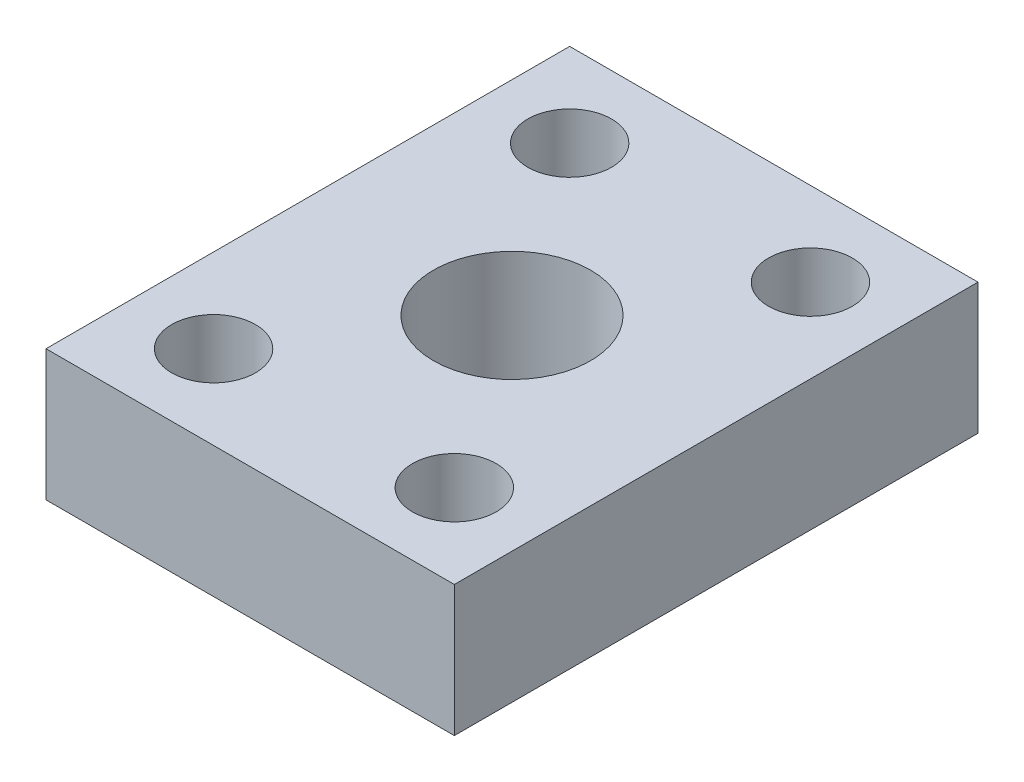
ISO-10303-21;
HEADER;
FILE_DESCRIPTION(('STEP AP214'),'2;1');
FILE_NAME('part.step','',(''),(''),'','','');
FILE_SCHEMA(('AUTOMOTIVE_DESIGN { 1 0 10303 214 1 1 1 1 }'));
ENDSEC;
DATA;
#1=APPLICATION_CONTEXT('core data for automotive mechanical design processes');
#2=APPLICATION_PROTOCOL_DEFINITION('international standard','automotive_design',2000,#1);
#3=PRODUCT_CONTEXT('',#1,'mechanical');
#4=PRODUCT('Part','Part','',(#3));
#5=PRODUCT_RELATED_PRODUCT_CATEGORY('part','',(#4));
#6=PRODUCT_DEFINITION_FORMATION('','',#4);
#7=PRODUCT_DEFINITION_CONTEXT('part definition',#1,'design');
#8=PRODUCT_DEFINITION('design','',#6,#7);
#9=PRODUCT_DEFINITION_SHAPE('','',#8);
#10=(LENGTH_UNIT() NAMED_UNIT(*) SI_UNIT(.MILLI.,.METRE.));
#11=(NAMED_UNIT(*) PLANE_ANGLE_UNIT() SI_UNIT($,.RADIAN.));
#12=(NAMED_UNIT(*) SI_UNIT($,.STERADIAN.) SOLID_ANGLE_UNIT());
#13=UNCERTAINTY_MEASURE_WITH_UNIT(LENGTH_MEASURE(1.E-05),#10,'distance_accuracy_value','');
#14=(GEOMETRIC_REPRESENTATION_CONTEXT(3) GLOBAL_UNCERTAINTY_ASSIGNED_CONTEXT((#13)) GLOBAL_UNIT_ASSIGNED_CONTEXT((#10,
#11,#12)) REPRESENTATION_CONTEXT('',''));
#15=CARTESIAN_POINT('',(0.,0.,0.));
#16=DIRECTION('',(0.,0.,1.));
#17=DIRECTION('',(1.,0.,0.));
#18=AXIS2_PLACEMENT_3D('',#15,#16,#17);
#19=CARTESIAN_POINT('',(0.,3.175,0.));
#20=DIRECTION('',(0.,1.,0.));
#21=DIRECTION('',(0.,0.,1.));
#22=AXIS2_PLACEMENT_3D('',#19,#20,#21);
#23=PLANE('',#22);
#24=CARTESIAN_POINT('',(9.65200000000006,3.175,4.31799999999987));
#25=DIRECTION('',(0.,1.,0.));
#26=DIRECTION('',(0.,0.,1.));
#27=AXIS2_PLACEMENT_3D('',#24,#25,#26);
#28=CIRCLE('',#27,1.016);
#29=CARTESIAN_POINT('',(9.65200000000006,3.175,5.33399999999988));
#30=VERTEX_POINT('',#29);
#31=EDGE_CURVE('E129',#30,#30,#28,.T.);
#32=ORIENTED_EDGE('',*,*,#31,.F.);
#33=EDGE_LOOP('',(#32));
#34=FACE_BOUND('',#33,.T.);
#35=CARTESIAN_POINT('',(15.4910871856785,3.175,-4.31800000000013));
#36=DIRECTION('',(0.,1.,0.));
#37=DIRECTION('',(0.,0.,1.));
#38=AXIS2_PLACEMENT_3D('',#35,#36,#37);
#39=CIRCLE('',#38,1.016);
#40=CARTESIAN_POINT('',(15.4910871856785,3.175,-3.30200000000013));
#41=VERTEX_POINT('',#40);
#42=EDGE_CURVE('E117',#41,#41,#39,.T.);
#43=ORIENTED_EDGE('',*,*,#42,.F.);
#44=EDGE_LOOP('',(#43));
#45=FACE_BOUND('',#44,.T.);
#46=DIRECTION('',(0.,0.,1.));
#47=VECTOR('',#46,1.);
#48=CARTESIAN_POINT('',(7.62,3.175,-6.35));
#49=LINE('',#48,#47);
#50=CARTESIAN_POINT('',(7.62,3.175,-6.35));
#51=VERTEX_POINT('',#50);
#52=CARTESIAN_POINT('',(7.62,3.175,6.35));
#53=VERTEX_POINT('',#52);
#54=EDGE_CURVE('E87',#51,#53,#49,.T.);
#55=ORIENTED_EDGE('',*,*,#54,.T.);
#56=DIRECTION('',(1.,0.,0.));
#57=VECTOR('',#56,1.);
#58=CARTESIAN_POINT('',(7.62,3.175,6.35));
#59=LINE('',#58,#57);
#60=CARTESIAN_POINT('',(17.5230871856784,3.175,6.35));
#61=VERTEX_POINT('',#60);
#62=EDGE_CURVE('E82',#53,#61,#59,.T.);
#63=ORIENTED_EDGE('',*,*,#62,.T.);
#64=DIRECTION('',(0.,0.,-1.));
#65=VECTOR('',#64,1.);
#66=CARTESIAN_POINT('',(17.5230871856784,3.175,-6.35));
#67=LINE('',#66,#65);
#68=CARTESIAN_POINT('',(17.5230871856784,3.175,-6.35));
#69=VERTEX_POINT('',#68);
#70=EDGE_CURVE('E85',#61,#69,#67,.T.);
#71=ORIENTED_EDGE('',*,*,#70,.T.);
#72=DIRECTION('',(-1.,0.,0.));
#73=VECTOR('',#72,1.);
#74=CARTESIAN_POINT('',(7.62,3.175,-6.35));
#75=LINE('',#74,#73);
#76=EDGE_CURVE('E52',#69,#51,#75,.T.);
#77=ORIENTED_EDGE('',*,*,#76,.T.);
#78=EDGE_LOOP('',(#55,#63,#71,#77));
#79=FACE_BOUND('',#78,.T.);
#80=CARTESIAN_POINT('',(12.5715435928393,3.175,-1.21430643318376E-13));
#81=DIRECTION('',(0.,1.,0.));
#82=DIRECTION('',(0.,0.,1.));
#83=AXIS2_PLACEMENT_3D('',#80,#81,#82);
#84=CIRCLE('',#83,1.905);
#85=CARTESIAN_POINT('',(12.5715435928393,3.175,1.90499999999988));
#86=VERTEX_POINT('',#85);
#87=EDGE_CURVE('E102',#86,#86,#84,.T.);
#88=ORIENTED_EDGE('',*,*,#87,.F.);
#89=EDGE_LOOP('',(#88));
#90=FACE_BOUND('',#89,.T.);
#91=CARTESIAN_POINT('',(9.65200000000006,3.175,-4.31800000000013));
#92=DIRECTION('',(0.,1.,0.));
#93=DIRECTION('',(0.,0.,1.));
#94=AXIS2_PLACEMENT_3D('',#91,#92,#93);
#95=CIRCLE('',#94,1.016);
#96=CARTESIAN_POINT('',(9.65200000000006,3.175,-3.30200000000013));
#97=VERTEX_POINT('',#96);
#98=EDGE_CURVE('E123',#97,#97,#95,.T.);
#99=ORIENTED_EDGE('',*,*,#98,.F.);
#100=EDGE_LOOP('',(#99));
#101=FACE_BOUND('',#100,.T.);
#102=CARTESIAN_POINT('',(15.4910871856785,3.175,4.31799999999987));
#103=DIRECTION('',(0.,1.,0.));
#104=DIRECTION('',(0.,0.,1.));
#105=AXIS2_PLACEMENT_3D('',#102,#103,#104);
#106=CIRCLE('',#105,1.016);
#107=CARTESIAN_POINT('',(15.4910871856785,3.175,5.33399999999988));
#108=VERTEX_POINT('',#107);
#109=EDGE_CURVE('E135',#108,#108,#106,.T.);
#110=ORIENTED_EDGE('',*,*,#109,.F.);
#111=EDGE_LOOP('',(#110));
#112=FACE_BOUND('',#111,.T.);
#113=ADVANCED_FACE('F35',(#34,#45,#79,#90,#101,#112),#23,.T.);
#114=CARTESIAN_POINT('',(0.,0.,0.));
#115=DIRECTION('',(0.,1.,0.));
#116=DIRECTION('',(0.,0.,1.));
#117=AXIS2_PLACEMENT_3D('',#114,#115,#116);
#118=PLANE('',#117);
#119=CARTESIAN_POINT('',(9.65200000000006,0.,4.31799999999987));
#120=DIRECTION('',(0.,1.,0.));
#121=DIRECTION('',(0.,0.,1.));
#122=AXIS2_PLACEMENT_3D('',#119,#120,#121);
#123=CIRCLE('',#122,1.016);
#124=CARTESIAN_POINT('',(9.65200000000006,0.,5.33399999999988));
#125=VERTEX_POINT('',#124);
#126=EDGE_CURVE('E132',#125,#125,#123,.T.);
#127=ORIENTED_EDGE('',*,*,#126,.T.);
#128=EDGE_LOOP('',(#127));
#129=FACE_BOUND('',#128,.T.);
#130=CARTESIAN_POINT('',(15.4910871856785,0.,-4.31800000000013));
#131=DIRECTION('',(0.,1.,0.));
#132=DIRECTION('',(0.,0.,1.));
#133=AXIS2_PLACEMENT_3D('',#130,#131,#132);
#134=CIRCLE('',#133,1.016);
#135=CARTESIAN_POINT('',(15.4910871856785,0.,-3.30200000000013));
#136=VERTEX_POINT('',#135);
#137=EDGE_CURVE('E120',#136,#136,#134,.T.);
#138=ORIENTED_EDGE('',*,*,#137,.T.);
#139=EDGE_LOOP('',(#138));
#140=FACE_BOUND('',#139,.T.);
#141=DIRECTION('',(0.,0.,1.));
#142=VECTOR('',#141,1.);
#143=CARTESIAN_POINT('',(7.62,0.,-6.35));
#144=LINE('',#143,#142);
#145=CARTESIAN_POINT('',(7.62,0.,-6.35));
#146=VERTEX_POINT('',#145);
#147=CARTESIAN_POINT('',(7.62,0.,6.35));
#148=VERTEX_POINT('',#147);
#149=EDGE_CURVE('E99',#146,#148,#144,.T.);
#150=ORIENTED_EDGE('',*,*,#149,.F.);
#151=DIRECTION('',(-1.,0.,0.));
#152=VECTOR('',#151,1.);
#153=CARTESIAN_POINT('',(7.62,0.,-6.35));
#154=LINE('',#153,#152);
#155=CARTESIAN_POINT('',(17.5230871856784,0.,-6.35));
#156=VERTEX_POINT('',#155);
#157=EDGE_CURVE('E75',#156,#146,#154,.T.);
#158=ORIENTED_EDGE('',*,*,#157,.F.);
#159=DIRECTION('',(0.,0.,-1.));
#160=VECTOR('',#159,1.);
#161=CARTESIAN_POINT('',(17.5230871856784,0.,-6.35));
#162=LINE('',#161,#160);
#163=CARTESIAN_POINT('',(17.5230871856784,0.,6.35));
#164=VERTEX_POINT('',#163);
#165=EDGE_CURVE('E69',#164,#156,#162,.T.);
#166=ORIENTED_EDGE('',*,*,#165,.F.);
#167=DIRECTION('',(1.,0.,0.));
#168=VECTOR('',#167,1.);
#169=CARTESIAN_POINT('',(7.62,0.,6.35));
#170=LINE('',#169,#168);
#171=EDGE_CURVE('E91',#148,#164,#170,.T.);
#172=ORIENTED_EDGE('',*,*,#171,.F.);
#173=EDGE_LOOP('',(#150,#158,#166,#172));
#174=FACE_BOUND('',#173,.T.);
#175=CARTESIAN_POINT('',(12.5715435928393,0.,-1.21430643318376E-13));
#176=DIRECTION('',(0.,1.,0.));
#177=DIRECTION('',(0.,0.,1.));
#178=AXIS2_PLACEMENT_3D('',#175,#176,#177);
#179=CIRCLE('',#178,1.905);
#180=CARTESIAN_POINT('',(12.5715435928393,0.,1.90499999999988));
#181=VERTEX_POINT('',#180);
#182=EDGE_CURVE('E114',#181,#181,#179,.T.);
#183=ORIENTED_EDGE('',*,*,#182,.T.);
#184=EDGE_LOOP('',(#183));
#185=FACE_BOUND('',#184,.T.);
#186=CARTESIAN_POINT('',(9.65200000000006,0.,-4.31800000000013));
#187=DIRECTION('',(0.,1.,0.));
#188=DIRECTION('',(0.,0.,1.));
#189=AXIS2_PLACEMENT_3D('',#186,#187,#188);
#190=CIRCLE('',#189,1.016);
#191=CARTESIAN_POINT('',(9.65200000000006,0.,-3.30200000000013));
#192=VERTEX_POINT('',#191);
#193=EDGE_CURVE('E126',#192,#192,#190,.T.);
#194=ORIENTED_EDGE('',*,*,#193,.T.);
#195=EDGE_LOOP('',(#194));
#196=FACE_BOUND('',#195,.T.);
#197=CARTESIAN_POINT('',(15.4910871856785,0.,4.31799999999987));
#198=DIRECTION('',(0.,1.,0.));
#199=DIRECTION('',(0.,0.,1.));
#200=AXIS2_PLACEMENT_3D('',#197,#198,#199);
#201=CIRCLE('',#200,1.016);
#202=CARTESIAN_POINT('',(15.4910871856785,0.,5.33399999999988));
#203=VERTEX_POINT('',#202);
#204=EDGE_CURVE('E138',#203,#203,#201,.T.);
#205=ORIENTED_EDGE('',*,*,#204,.T.);
#206=EDGE_LOOP('',(#205));
#207=FACE_BOUND('',#206,.T.);
#208=ADVANCED_FACE('F110',(#129,#140,#174,#185,#196,#207),#118,.F.);
#209=CARTESIAN_POINT('',(7.62,3.175,-6.35));
#210=DIRECTION('',(1.,0.,0.));
#211=DIRECTION('',(0.,0.,-1.));
#212=AXIS2_PLACEMENT_3D('',#209,#210,#211);
#213=PLANE('',#212);
#214=ORIENTED_EDGE('',*,*,#149,.T.);
#215=DIRECTION('',(0.,-1.,0.));
#216=VECTOR('',#215,1.);
#217=CARTESIAN_POINT('',(7.62,3.175,6.35));
#218=LINE('',#217,#216);
#219=EDGE_CURVE('E11',#53,#148,#218,.T.);
#220=ORIENTED_EDGE('',*,*,#219,.F.);
#221=ORIENTED_EDGE('',*,*,#54,.F.);
#222=DIRECTION('',(0.,-1.,0.));
#223=VECTOR('',#222,1.);
#224=CARTESIAN_POINT('',(7.62,3.175,-6.35));
#225=LINE('',#224,#223);
#226=EDGE_CURVE('E95',#51,#146,#225,.T.);
#227=ORIENTED_EDGE('',*,*,#226,.T.);
#228=EDGE_LOOP('',(#214,#220,#221,#227));
#229=FACE_BOUND('',#228,.T.);
#230=ADVANCED_FACE('F37',(#229),#213,.F.);
#231=CARTESIAN_POINT('',(7.62,3.175,6.35));
#232=DIRECTION('',(0.,0.,-1.));
#233=DIRECTION('',(-1.,0.,0.));
#234=AXIS2_PLACEMENT_3D('',#231,#232,#233);
#235=PLANE('',#234);
#236=ORIENTED_EDGE('',*,*,#171,.T.);
#237=DIRECTION('',(0.,-1.,0.));
#238=VECTOR('',#237,1.);
#239=CARTESIAN_POINT('',(17.5230871856784,3.175,6.35));
#240=LINE('',#239,#238);
#241=EDGE_CURVE('E44',#61,#164,#240,.T.);
#242=ORIENTED_EDGE('',*,*,#241,.F.);
#243=ORIENTED_EDGE('',*,*,#62,.F.);
#244=ORIENTED_EDGE('',*,*,#219,.T.);
#245=EDGE_LOOP('',(#236,#242,#243,#244));
#246=FACE_BOUND('',#245,.T.);
#247=ADVANCED_FACE('F90',(#246),#235,.F.);
#248=CARTESIAN_POINT('',(17.5230871856784,3.175,-6.35));
#249=DIRECTION('',(-1.,0.,0.));
#250=DIRECTION('',(0.,0.,1.));
#251=AXIS2_PLACEMENT_3D('',#248,#249,#250);
#252=PLANE('',#251);
#253=ORIENTED_EDGE('',*,*,#165,.T.);
#254=DIRECTION('',(0.,-1.,0.));
#255=VECTOR('',#254,1.);
#256=CARTESIAN_POINT('',(17.5230871856784,3.175,-6.35));
#257=LINE('',#256,#255);
#258=EDGE_CURVE('E92',#69,#156,#257,.T.);
#259=ORIENTED_EDGE('',*,*,#258,.F.);
#260=ORIENTED_EDGE('',*,*,#70,.F.);
#261=ORIENTED_EDGE('',*,*,#241,.T.);
#262=EDGE_LOOP('',(#253,#259,#260,#261));
#263=FACE_BOUND('',#262,.T.);
#264=ADVANCED_FACE('F93',(#263),#252,.F.);
#265=CARTESIAN_POINT('',(7.62,3.175,-6.35));
#266=DIRECTION('',(0.,0.,1.));
#267=DIRECTION('',(1.,0.,0.));
#268=AXIS2_PLACEMENT_3D('',#265,#266,#267);
#269=PLANE('',#268);
#270=ORIENTED_EDGE('',*,*,#157,.T.);
#271=ORIENTED_EDGE('',*,*,#226,.F.);
#272=ORIENTED_EDGE('',*,*,#76,.F.);
#273=ORIENTED_EDGE('',*,*,#258,.T.);
#274=EDGE_LOOP('',(#270,#271,#272,#273));
#275=FACE_BOUND('',#274,.T.);
#276=ADVANCED_FACE('F107',(#275),#269,.F.);
#277=CARTESIAN_POINT('',(12.5715435928393,3.175,-1.21430643318376E-13));
#278=DIRECTION('',(0.,-1.,0.));
#279=DIRECTION('',(0.,0.,-1.));
#280=AXIS2_PLACEMENT_3D('',#277,#278,#279);
#281=CYLINDRICAL_SURFACE('',#280,1.905);
#282=ORIENTED_EDGE('',*,*,#87,.T.);
#283=EDGE_LOOP('',(#282));
#284=FACE_BOUND('',#283,.T.);
#285=ORIENTED_EDGE('',*,*,#182,.F.);
#286=EDGE_LOOP('',(#285));
#287=FACE_BOUND('',#286,.T.);
#288=ADVANCED_FACE('F158',(#284,#287),#281,.F.);
#289=CARTESIAN_POINT('',(15.4910871856785,3.175,-4.31800000000013));
#290=DIRECTION('',(0.,-1.,0.));
#291=DIRECTION('',(0.,0.,-1.));
#292=AXIS2_PLACEMENT_3D('',#289,#290,#291);
#293=CYLINDRICAL_SURFACE('',#292,1.016);
#294=ORIENTED_EDGE('',*,*,#42,.T.);
#295=EDGE_LOOP('',(#294));
#296=FACE_BOUND('',#295,.T.);
#297=ORIENTED_EDGE('',*,*,#137,.F.);
#298=EDGE_LOOP('',(#297));
#299=FACE_BOUND('',#298,.T.);
#300=ADVANCED_FACE('F204',(#296,#299),#293,.F.);
#301=CARTESIAN_POINT('',(9.65200000000006,3.175,-4.31800000000013));
#302=DIRECTION('',(0.,-1.,0.));
#303=DIRECTION('',(0.,0.,-1.));
#304=AXIS2_PLACEMENT_3D('',#301,#302,#303);
#305=CYLINDRICAL_SURFACE('',#304,1.016);
#306=ORIENTED_EDGE('',*,*,#98,.T.);
#307=EDGE_LOOP('',(#306));
#308=FACE_BOUND('',#307,.T.);
#309=ORIENTED_EDGE('',*,*,#193,.F.);
#310=EDGE_LOOP('',(#309));
#311=FACE_BOUND('',#310,.T.);
#312=ADVANCED_FACE('F213',(#308,#311),#305,.F.);
#313=CARTESIAN_POINT('',(9.65200000000006,3.175,4.31799999999987));
#314=DIRECTION('',(0.,-1.,0.));
#315=DIRECTION('',(0.,0.,-1.));
#316=AXIS2_PLACEMENT_3D('',#313,#314,#315);
#317=CYLINDRICAL_SURFACE('',#316,1.016);
#318=ORIENTED_EDGE('',*,*,#31,.T.);
#319=EDGE_LOOP('',(#318));
#320=FACE_BOUND('',#319,.T.);
#321=ORIENTED_EDGE('',*,*,#126,.F.);
#322=EDGE_LOOP('',(#321));
#323=FACE_BOUND('',#322,.T.);
#324=ADVANCED_FACE('F222',(#320,#323),#317,.F.);
#325=CARTESIAN_POINT('',(15.4910871856785,3.175,4.31799999999987));
#326=DIRECTION('',(0.,-1.,0.));
#327=DIRECTION('',(0.,0.,-1.));
#328=AXIS2_PLACEMENT_3D('',#325,#326,#327);
#329=CYLINDRICAL_SURFACE('',#328,1.016);
#330=ORIENTED_EDGE('',*,*,#109,.T.);
#331=EDGE_LOOP('',(#330));
#332=FACE_BOUND('',#331,.T.);
#333=ORIENTED_EDGE('',*,*,#204,.F.);
#334=EDGE_LOOP('',(#333));
#335=FACE_BOUND('',#334,.T.);
#336=ADVANCED_FACE('F144',(#332,#335),#329,.F.);
#337=CLOSED_SHELL('',(#113,#208,#230,#247,#264,#276,#288,#300,#312,#324,#336));
#338=MANIFOLD_SOLID_BREP('B2',#337);
#339=ADVANCED_BREP_SHAPE_REPRESENTATION('',(#18,#338),#14);
#340=SHAPE_DEFINITION_REPRESENTATION(#9,#339);
ENDSEC;
END-ISO-10303-21;
